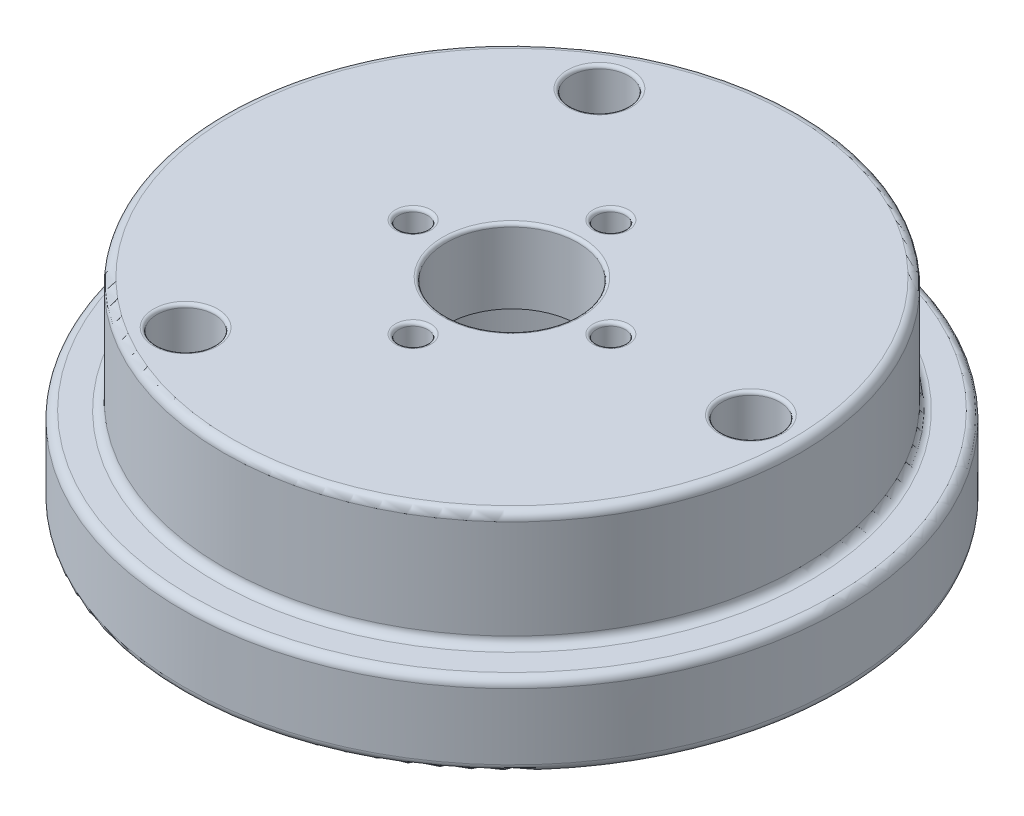
ISO-10303-21;
HEADER;
FILE_DESCRIPTION(('STEP AP214'),'2;1');
FILE_NAME('part.step','',(''),(''),'','','');
FILE_SCHEMA(('AUTOMOTIVE_DESIGN { 1 0 10303 214 1 1 1 1 }'));
ENDSEC;
DATA;
#1=APPLICATION_CONTEXT('core data for automotive mechanical design processes');
#2=APPLICATION_PROTOCOL_DEFINITION('international standard','automotive_design',2000,#1);
#3=PRODUCT_CONTEXT('',#1,'mechanical');
#4=PRODUCT('Part','Part','',(#3));
#5=PRODUCT_RELATED_PRODUCT_CATEGORY('part','',(#4));
#6=PRODUCT_DEFINITION_FORMATION('','',#4);
#7=PRODUCT_DEFINITION_CONTEXT('part definition',#1,'design');
#8=PRODUCT_DEFINITION('design','',#6,#7);
#9=PRODUCT_DEFINITION_SHAPE('','',#8);
#10=(LENGTH_UNIT() NAMED_UNIT(*) SI_UNIT(.MILLI.,.METRE.));
#11=(NAMED_UNIT(*) PLANE_ANGLE_UNIT() SI_UNIT($,.RADIAN.));
#12=(NAMED_UNIT(*) SI_UNIT($,.STERADIAN.) SOLID_ANGLE_UNIT());
#13=UNCERTAINTY_MEASURE_WITH_UNIT(LENGTH_MEASURE(1.E-05),#10,'distance_accuracy_value','');
#14=(GEOMETRIC_REPRESENTATION_CONTEXT(3) GLOBAL_UNCERTAINTY_ASSIGNED_CONTEXT((#13)) GLOBAL_UNIT_ASSIGNED_CONTEXT((#10,
#11,#12)) REPRESENTATION_CONTEXT('',''));
#15=CARTESIAN_POINT('',(0.,0.,0.));
#16=DIRECTION('',(0.,0.,1.));
#17=DIRECTION('',(1.,0.,0.));
#18=AXIS2_PLACEMENT_3D('',#15,#16,#17);
#19=CARTESIAN_POINT('',(0.,12.,0.));
#20=DIRECTION('',(0.,-1.,0.));
#21=DIRECTION('',(0.,0.,-1.));
#22=AXIS2_PLACEMENT_3D('',#19,#20,#21);
#23=CYLINDRICAL_SURFACE('',#22,4.);
#24=CARTESIAN_POINT('',(0.,11.8,0.));
#25=DIRECTION('',(0.,-1.,0.));
#26=DIRECTION('',(0.,0.,-1.));
#27=AXIS2_PLACEMENT_3D('',#24,#25,#26);
#28=CIRCLE('',#27,4.);
#29=CARTESIAN_POINT('',(0.,11.8,-4.));
#30=VERTEX_POINT('',#29);
#31=EDGE_CURVE('E83',#30,#30,#28,.F.);
#32=ORIENTED_EDGE('',*,*,#31,.T.);
#33=EDGE_LOOP('',(#32));
#34=FACE_BOUND('',#33,.T.);
#35=CARTESIAN_POINT('',(0.,7.5,0.));
#36=DIRECTION('',(0.,-1.,0.));
#37=DIRECTION('',(0.,0.,-1.));
#38=AXIS2_PLACEMENT_3D('',#35,#36,#37);
#39=CIRCLE('',#38,4.);
#40=CARTESIAN_POINT('',(0.,7.5,-4.));
#41=VERTEX_POINT('',#40);
#42=EDGE_CURVE('E137',#41,#41,#39,.T.);
#43=ORIENTED_EDGE('',*,*,#42,.T.);
#44=EDGE_LOOP('',(#43));
#45=FACE_BOUND('',#44,.T.);
#46=ADVANCED_FACE('F30',(#34,#45),#23,.F.);
#47=CARTESIAN_POINT('',(-6.,12.,0.));
#48=DIRECTION('',(0.,-1.,0.));
#49=DIRECTION('',(0.,0.,-1.));
#50=AXIS2_PLACEMENT_3D('',#47,#48,#49);
#51=CYLINDRICAL_SURFACE('',#50,0.875);
#52=CARTESIAN_POINT('',(-6.,11.8,0.));
#53=DIRECTION('',(0.,-1.,0.));
#54=DIRECTION('',(0.,0.,-1.));
#55=AXIS2_PLACEMENT_3D('',#52,#53,#54);
#56=CIRCLE('',#55,0.875);
#57=CARTESIAN_POINT('',(-6.,11.8,-0.875));
#58=VERTEX_POINT('',#57);
#59=EDGE_CURVE('E74',#58,#58,#56,.F.);
#60=ORIENTED_EDGE('',*,*,#59,.T.);
#61=EDGE_LOOP('',(#60));
#62=FACE_BOUND('',#61,.T.);
#63=CARTESIAN_POINT('',(-6.,7.5,0.));
#64=DIRECTION('',(0.,-1.,0.));
#65=DIRECTION('',(0.,0.,-1.));
#66=AXIS2_PLACEMENT_3D('',#63,#64,#65);
#67=CIRCLE('',#66,0.875);
#68=CARTESIAN_POINT('',(-6.,7.5,-0.875));
#69=VERTEX_POINT('',#68);
#70=EDGE_CURVE('E146',#69,#69,#67,.T.);
#71=ORIENTED_EDGE('',*,*,#70,.T.);
#72=EDGE_LOOP('',(#71));
#73=FACE_BOUND('',#72,.T.);
#74=ADVANCED_FACE('F180',(#62,#73),#51,.F.);
#75=CARTESIAN_POINT('',(0.,12.,-6.));
#76=DIRECTION('',(0.,-1.,0.));
#77=DIRECTION('',(0.,0.,-1.));
#78=AXIS2_PLACEMENT_3D('',#75,#76,#77);
#79=CYLINDRICAL_SURFACE('',#78,0.875);
#80=CARTESIAN_POINT('',(0.,11.8,-6.));
#81=DIRECTION('',(0.,-1.,0.));
#82=DIRECTION('',(0.,0.,-1.));
#83=AXIS2_PLACEMENT_3D('',#80,#81,#82);
#84=CIRCLE('',#83,0.875);
#85=CARTESIAN_POINT('',(0.,11.8,-6.875));
#86=VERTEX_POINT('',#85);
#87=EDGE_CURVE('E71',#86,#86,#84,.F.);
#88=ORIENTED_EDGE('',*,*,#87,.T.);
#89=EDGE_LOOP('',(#88));
#90=FACE_BOUND('',#89,.T.);
#91=CARTESIAN_POINT('',(0.,7.5,-6.));
#92=DIRECTION('',(0.,-1.,0.));
#93=DIRECTION('',(0.,0.,-1.));
#94=AXIS2_PLACEMENT_3D('',#91,#92,#93);
#95=CIRCLE('',#94,0.875);
#96=CARTESIAN_POINT('',(0.,7.5,-6.875));
#97=VERTEX_POINT('',#96);
#98=EDGE_CURVE('E143',#97,#97,#95,.T.);
#99=ORIENTED_EDGE('',*,*,#98,.T.);
#100=EDGE_LOOP('',(#99));
#101=FACE_BOUND('',#100,.T.);
#102=ADVANCED_FACE('F186',(#90,#101),#79,.F.);
#103=CARTESIAN_POINT('',(6.,12.,0.));
#104=DIRECTION('',(0.,-1.,0.));
#105=DIRECTION('',(0.,0.,-1.));
#106=AXIS2_PLACEMENT_3D('',#103,#104,#105);
#107=CYLINDRICAL_SURFACE('',#106,0.875);
#108=CARTESIAN_POINT('',(6.,11.8,0.));
#109=DIRECTION('',(0.,-1.,0.));
#110=DIRECTION('',(0.,0.,-1.));
#111=AXIS2_PLACEMENT_3D('',#108,#109,#110);
#112=CIRCLE('',#111,0.875);
#113=CARTESIAN_POINT('',(6.,11.8,-0.875));
#114=VERTEX_POINT('',#113);
#115=EDGE_CURVE('E68',#114,#114,#112,.F.);
#116=ORIENTED_EDGE('',*,*,#115,.T.);
#117=EDGE_LOOP('',(#116));
#118=FACE_BOUND('',#117,.T.);
#119=CARTESIAN_POINT('',(6.,7.5,0.));
#120=DIRECTION('',(0.,-1.,0.));
#121=DIRECTION('',(0.,0.,-1.));
#122=AXIS2_PLACEMENT_3D('',#119,#120,#121);
#123=CIRCLE('',#122,0.875);
#124=CARTESIAN_POINT('',(6.,7.5,-0.875));
#125=VERTEX_POINT('',#124);
#126=EDGE_CURVE('E140',#125,#125,#123,.T.);
#127=ORIENTED_EDGE('',*,*,#126,.T.);
#128=EDGE_LOOP('',(#127));
#129=FACE_BOUND('',#128,.T.);
#130=ADVANCED_FACE('F404',(#118,#129),#107,.F.);
#131=CARTESIAN_POINT('',(0.,12.,6.));
#132=DIRECTION('',(0.,-1.,0.));
#133=DIRECTION('',(0.,0.,-1.));
#134=AXIS2_PLACEMENT_3D('',#131,#132,#133);
#135=CYLINDRICAL_SURFACE('',#134,0.875);
#136=CARTESIAN_POINT('',(0.,11.8,6.));
#137=DIRECTION('',(0.,-1.,0.));
#138=DIRECTION('',(0.,0.,-1.));
#139=AXIS2_PLACEMENT_3D('',#136,#137,#138);
#140=CIRCLE('',#139,0.875);
#141=CARTESIAN_POINT('',(0.,11.8,5.125));
#142=VERTEX_POINT('',#141);
#143=EDGE_CURVE('E65',#142,#142,#140,.F.);
#144=ORIENTED_EDGE('',*,*,#143,.T.);
#145=EDGE_LOOP('',(#144));
#146=FACE_BOUND('',#145,.T.);
#147=CARTESIAN_POINT('',(0.,7.5,6.));
#148=DIRECTION('',(0.,-1.,0.));
#149=DIRECTION('',(0.,0.,-1.));
#150=AXIS2_PLACEMENT_3D('',#147,#148,#149);
#151=CIRCLE('',#150,0.875);
#152=CARTESIAN_POINT('',(0.,7.5,5.125));
#153=VERTEX_POINT('',#152);
#154=EDGE_CURVE('E149',#153,#153,#151,.T.);
#155=ORIENTED_EDGE('',*,*,#154,.T.);
#156=EDGE_LOOP('',(#155));
#157=FACE_BOUND('',#156,.T.);
#158=ADVANCED_FACE('F153',(#146,#157),#135,.F.);
#159=CARTESIAN_POINT('',(0.,0.,0.));
#160=DIRECTION('',(0.,1.,0.));
#161=DIRECTION('',(0.,0.,1.));
#162=AXIS2_PLACEMENT_3D('',#159,#160,#161);
#163=PLANE('',#162);
#164=CARTESIAN_POINT('',(14.5,0.,0.));
#165=DIRECTION('',(0.,1.,0.));
#166=DIRECTION('',(0.,0.,1.));
#167=AXIS2_PLACEMENT_3D('',#164,#165,#166);
#168=CIRCLE('',#167,1.85);
#169=CARTESIAN_POINT('',(14.5,0.,1.85));
#170=VERTEX_POINT('',#169);
#171=EDGE_CURVE('E45',#170,#170,#168,.T.);
#172=ORIENTED_EDGE('',*,*,#171,.T.);
#173=EDGE_LOOP('',(#172));
#174=FACE_BOUND('',#173,.T.);
#175=CARTESIAN_POINT('',(-7.24999999999988,0.,12.5573683548744));
#176=DIRECTION('',(0.,1.,0.));
#177=DIRECTION('',(0.,0.,1.));
#178=AXIS2_PLACEMENT_3D('',#175,#176,#177);
#179=CIRCLE('',#178,1.85);
#180=CARTESIAN_POINT('',(-7.24999999999988,0.,14.4073683548744));
#181=VERTEX_POINT('',#180);
#182=EDGE_CURVE('E50',#181,#181,#179,.T.);
#183=ORIENTED_EDGE('',*,*,#182,.T.);
#184=EDGE_LOOP('',(#183));
#185=FACE_BOUND('',#184,.T.);
#186=CARTESIAN_POINT('',(-7.25000000000006,0.,-12.5573683548743));
#187=DIRECTION('',(0.,1.,0.));
#188=DIRECTION('',(0.,0.,1.));
#189=AXIS2_PLACEMENT_3D('',#186,#187,#188);
#190=CIRCLE('',#189,1.85);
#191=CARTESIAN_POINT('',(-7.25000000000006,0.,-10.7073683548743));
#192=VERTEX_POINT('',#191);
#193=EDGE_CURVE('E53',#192,#192,#190,.T.);
#194=ORIENTED_EDGE('',*,*,#193,.T.);
#195=EDGE_LOOP('',(#194));
#196=FACE_BOUND('',#195,.T.);
#197=CARTESIAN_POINT('',(0.,0.,0.));
#198=DIRECTION('',(0.,1.,0.));
#199=DIRECTION('',(0.,0.,1.));
#200=AXIS2_PLACEMENT_3D('',#197,#198,#199);
#201=CIRCLE('',#200,10.1);
#202=CARTESIAN_POINT('',(0.,0.,10.1));
#203=VERTEX_POINT('',#202);
#204=EDGE_CURVE('E56',#203,#203,#201,.T.);
#205=ORIENTED_EDGE('',*,*,#204,.T.);
#206=EDGE_LOOP('',(#205));
#207=FACE_BOUND('',#206,.T.);
#208=CARTESIAN_POINT('',(0.,0.,0.));
#209=DIRECTION('',(0.,1.,0.));
#210=DIRECTION('',(0.,0.,1.));
#211=AXIS2_PLACEMENT_3D('',#208,#209,#210);
#212=CIRCLE('',#211,19.5);
#213=CARTESIAN_POINT('',(0.,0.,19.5));
#214=VERTEX_POINT('',#213);
#215=EDGE_CURVE('E131',#214,#214,#212,.F.);
#216=ORIENTED_EDGE('',*,*,#215,.T.);
#217=EDGE_LOOP('',(#216));
#218=FACE_BOUND('',#217,.T.);
#219=ADVANCED_FACE('F215',(#174,#185,#196,#207,#218),#163,.F.);
#220=CARTESIAN_POINT('',(0.,0.,0.));
#221=DIRECTION('',(0.,-1.,0.));
#222=DIRECTION('',(0.,0.,-1.));
#223=AXIS2_PLACEMENT_3D('',#220,#221,#222);
#224=CYLINDRICAL_SURFACE('',#223,20.);
#225=CARTESIAN_POINT('',(0.,0.5,0.));
#226=DIRECTION('',(0.,1.,0.));
#227=DIRECTION('',(0.,0.,1.));
#228=AXIS2_PLACEMENT_3D('',#225,#226,#227);
#229=CIRCLE('',#228,20.);
#230=CARTESIAN_POINT('',(0.,0.5,20.));
#231=VERTEX_POINT('',#230);
#232=EDGE_CURVE('E125',#231,#231,#229,.T.);
#233=ORIENTED_EDGE('',*,*,#232,.T.);
#234=EDGE_LOOP('',(#233));
#235=FACE_BOUND('',#234,.T.);
#236=CARTESIAN_POINT('',(0.,4.5,0.));
#237=DIRECTION('',(0.,-1.,0.));
#238=DIRECTION('',(0.,0.,-1.));
#239=AXIS2_PLACEMENT_3D('',#236,#237,#238);
#240=CIRCLE('',#239,20.);
#241=CARTESIAN_POINT('',(0.,4.5,-20.));
#242=VERTEX_POINT('',#241);
#243=EDGE_CURVE('E128',#242,#242,#240,.T.);
#244=ORIENTED_EDGE('',*,*,#243,.T.);
#245=EDGE_LOOP('',(#244));
#246=FACE_BOUND('',#245,.T.);
#247=ADVANCED_FACE('F211',(#235,#246),#224,.T.);
#248=CARTESIAN_POINT('',(-20.,5.,0.));
#249=DIRECTION('',(0.,-1.,0.));
#250=DIRECTION('',(0.,0.,-1.));
#251=AXIS2_PLACEMENT_3D('',#248,#249,#250);
#252=PLANE('',#251);
#253=CARTESIAN_POINT('',(0.,5.,0.));
#254=DIRECTION('',(0.,-1.,0.));
#255=DIRECTION('',(0.,0.,-1.));
#256=AXIS2_PLACEMENT_3D('',#253,#254,#255);
#257=CIRCLE('',#256,19.5);
#258=CARTESIAN_POINT('',(0.,5.,-19.5));
#259=VERTEX_POINT('',#258);
#260=EDGE_CURVE('E119',#259,#259,#257,.F.);
#261=ORIENTED_EDGE('',*,*,#260,.T.);
#262=EDGE_LOOP('',(#261));
#263=FACE_BOUND('',#262,.T.);
#264=CARTESIAN_POINT('',(0.,5.,0.));
#265=DIRECTION('',(0.,-1.,0.));
#266=DIRECTION('',(0.,0.,-1.));
#267=AXIS2_PLACEMENT_3D('',#264,#265,#266);
#268=CIRCLE('',#267,18.);
#269=CARTESIAN_POINT('',(0.,5.,-18.));
#270=VERTEX_POINT('',#269);
#271=EDGE_CURVE('E122',#270,#270,#268,.T.);
#272=ORIENTED_EDGE('',*,*,#271,.T.);
#273=EDGE_LOOP('',(#272));
#274=FACE_BOUND('',#273,.T.);
#275=ADVANCED_FACE('F207',(#263,#274),#252,.F.);
#276=CARTESIAN_POINT('',(0.,0.,0.));
#277=DIRECTION('',(0.,-1.,0.));
#278=DIRECTION('',(0.,0.,-1.));
#279=AXIS2_PLACEMENT_3D('',#276,#277,#278);
#280=CYLINDRICAL_SURFACE('',#279,17.5);
#281=CARTESIAN_POINT('',(0.,5.5,0.));
#282=DIRECTION('',(0.,-1.,0.));
#283=DIRECTION('',(0.,0.,-1.));
#284=AXIS2_PLACEMENT_3D('',#281,#282,#283);
#285=CIRCLE('',#284,17.5);
#286=CARTESIAN_POINT('',(0.,5.5,-17.5));
#287=VERTEX_POINT('',#286);
#288=EDGE_CURVE('E113',#287,#287,#285,.F.);
#289=ORIENTED_EDGE('',*,*,#288,.T.);
#290=EDGE_LOOP('',(#289));
#291=FACE_BOUND('',#290,.T.);
#292=CARTESIAN_POINT('',(0.,11.5,0.));
#293=DIRECTION('',(0.,-1.,0.));
#294=DIRECTION('',(0.,0.,-1.));
#295=AXIS2_PLACEMENT_3D('',#292,#293,#294);
#296=CIRCLE('',#295,17.5);
#297=CARTESIAN_POINT('',(0.,11.5,-17.5));
#298=VERTEX_POINT('',#297);
#299=EDGE_CURVE('E116',#298,#298,#296,.T.);
#300=ORIENTED_EDGE('',*,*,#299,.T.);
#301=EDGE_LOOP('',(#300));
#302=FACE_BOUND('',#301,.T.);
#303=ADVANCED_FACE('F203',(#291,#302),#280,.T.);
#304=CARTESIAN_POINT('',(-17.5,12.,0.));
#305=DIRECTION('',(0.,-1.,0.));
#306=DIRECTION('',(0.,0.,-1.));
#307=AXIS2_PLACEMENT_3D('',#304,#305,#306);
#308=PLANE('',#307);
#309=CARTESIAN_POINT('',(0.,12.,0.));
#310=DIRECTION('',(0.,-1.,0.));
#311=DIRECTION('',(0.,0.,-1.));
#312=AXIS2_PLACEMENT_3D('',#309,#310,#311);
#313=CIRCLE('',#312,4.2);
#314=CARTESIAN_POINT('',(0.,12.,-4.2));
#315=VERTEX_POINT('',#314);
#316=EDGE_CURVE('E86',#315,#315,#313,.T.);
#317=ORIENTED_EDGE('',*,*,#316,.T.);
#318=EDGE_LOOP('',(#317));
#319=FACE_BOUND('',#318,.T.);
#320=CARTESIAN_POINT('',(14.5,12.,0.));
#321=DIRECTION('',(0.,-1.,0.));
#322=DIRECTION('',(0.,0.,-1.));
#323=AXIS2_PLACEMENT_3D('',#320,#321,#322);
#324=CIRCLE('',#323,1.95);
#325=CARTESIAN_POINT('',(14.5,12.,-1.95));
#326=VERTEX_POINT('',#325);
#327=EDGE_CURVE('E89',#326,#326,#324,.T.);
#328=ORIENTED_EDGE('',*,*,#327,.T.);
#329=EDGE_LOOP('',(#328));
#330=FACE_BOUND('',#329,.T.);
#331=CARTESIAN_POINT('',(-7.24999999999988,12.,12.5573683548744));
#332=DIRECTION('',(0.,-1.,0.));
#333=DIRECTION('',(0.,0.,-1.));
#334=AXIS2_PLACEMENT_3D('',#331,#332,#333);
#335=CIRCLE('',#334,1.95);
#336=CARTESIAN_POINT('',(-7.24999999999988,12.,10.6073683548744));
#337=VERTEX_POINT('',#336);
#338=EDGE_CURVE('E92',#337,#337,#335,.T.);
#339=ORIENTED_EDGE('',*,*,#338,.T.);
#340=EDGE_LOOP('',(#339));
#341=FACE_BOUND('',#340,.T.);
#342=CARTESIAN_POINT('',(-6.,12.,0.));
#343=DIRECTION('',(0.,-1.,0.));
#344=DIRECTION('',(0.,0.,-1.));
#345=AXIS2_PLACEMENT_3D('',#342,#343,#344);
#346=CIRCLE('',#345,1.075);
#347=CARTESIAN_POINT('',(-6.,12.,-1.075));
#348=VERTEX_POINT('',#347);
#349=EDGE_CURVE('E95',#348,#348,#346,.T.);
#350=ORIENTED_EDGE('',*,*,#349,.T.);
#351=EDGE_LOOP('',(#350));
#352=FACE_BOUND('',#351,.T.);
#353=CARTESIAN_POINT('',(0.,12.,-6.));
#354=DIRECTION('',(0.,-1.,0.));
#355=DIRECTION('',(0.,0.,-1.));
#356=AXIS2_PLACEMENT_3D('',#353,#354,#355);
#357=CIRCLE('',#356,1.075);
#358=CARTESIAN_POINT('',(0.,12.,-7.075));
#359=VERTEX_POINT('',#358);
#360=EDGE_CURVE('E98',#359,#359,#357,.T.);
#361=ORIENTED_EDGE('',*,*,#360,.T.);
#362=EDGE_LOOP('',(#361));
#363=FACE_BOUND('',#362,.T.);
#364=CARTESIAN_POINT('',(6.,12.,0.));
#365=DIRECTION('',(0.,-1.,0.));
#366=DIRECTION('',(0.,0.,-1.));
#367=AXIS2_PLACEMENT_3D('',#364,#365,#366);
#368=CIRCLE('',#367,1.075);
#369=CARTESIAN_POINT('',(6.,12.,-1.075));
#370=VERTEX_POINT('',#369);
#371=EDGE_CURVE('E101',#370,#370,#368,.T.);
#372=ORIENTED_EDGE('',*,*,#371,.T.);
#373=EDGE_LOOP('',(#372));
#374=FACE_BOUND('',#373,.T.);
#375=CARTESIAN_POINT('',(0.,12.,6.));
#376=DIRECTION('',(0.,-1.,0.));
#377=DIRECTION('',(0.,0.,-1.));
#378=AXIS2_PLACEMENT_3D('',#375,#376,#377);
#379=CIRCLE('',#378,1.075);
#380=CARTESIAN_POINT('',(0.,12.,4.925));
#381=VERTEX_POINT('',#380);
#382=EDGE_CURVE('E104',#381,#381,#379,.T.);
#383=ORIENTED_EDGE('',*,*,#382,.T.);
#384=EDGE_LOOP('',(#383));
#385=FACE_BOUND('',#384,.T.);
#386=CARTESIAN_POINT('',(-7.25000000000006,12.,-12.5573683548743));
#387=DIRECTION('',(0.,-1.,0.));
#388=DIRECTION('',(0.,0.,-1.));
#389=AXIS2_PLACEMENT_3D('',#386,#387,#388);
#390=CIRCLE('',#389,1.95);
#391=CARTESIAN_POINT('',(-7.25000000000006,12.,-14.5073683548743));
#392=VERTEX_POINT('',#391);
#393=EDGE_CURVE('E107',#392,#392,#390,.T.);
#394=ORIENTED_EDGE('',*,*,#393,.T.);
#395=EDGE_LOOP('',(#394));
#396=FACE_BOUND('',#395,.T.);
#397=CARTESIAN_POINT('',(0.,12.,0.));
#398=DIRECTION('',(0.,-1.,0.));
#399=DIRECTION('',(0.,0.,-1.));
#400=AXIS2_PLACEMENT_3D('',#397,#398,#399);
#401=CIRCLE('',#400,17.);
#402=CARTESIAN_POINT('',(0.,12.,-17.));
#403=VERTEX_POINT('',#402);
#404=EDGE_CURVE('E110',#403,#403,#401,.F.);
#405=ORIENTED_EDGE('',*,*,#404,.T.);
#406=EDGE_LOOP('',(#405));
#407=FACE_BOUND('',#406,.T.);
#408=ADVANCED_FACE('F196',(#319,#330,#341,#352,#363,#374,#385,#396,#407),#308,.F.);
#409=CARTESIAN_POINT('',(14.5,12.,0.));
#410=DIRECTION('',(0.,-1.,0.));
#411=DIRECTION('',(0.,0.,-1.));
#412=AXIS2_PLACEMENT_3D('',#409,#410,#411);
#413=CYLINDRICAL_SURFACE('',#412,1.75);
#414=CARTESIAN_POINT('',(14.5,0.0999999999999994,0.));
#415=DIRECTION('',(0.,1.,0.));
#416=DIRECTION('',(0.,0.,1.));
#417=AXIS2_PLACEMENT_3D('',#414,#415,#416);
#418=CIRCLE('',#417,1.75);
#419=CARTESIAN_POINT('',(14.5,0.0999999999999994,1.75));
#420=VERTEX_POINT('',#419);
#421=EDGE_CURVE('E59',#420,#420,#418,.F.);
#422=ORIENTED_EDGE('',*,*,#421,.T.);
#423=EDGE_LOOP('',(#422));
#424=FACE_BOUND('',#423,.T.);
#425=CARTESIAN_POINT('',(14.5,11.8,0.));
#426=DIRECTION('',(0.,-1.,0.));
#427=DIRECTION('',(0.,0.,-1.));
#428=AXIS2_PLACEMENT_3D('',#425,#426,#427);
#429=CIRCLE('',#428,1.75);
#430=CARTESIAN_POINT('',(14.5,11.8,-1.75));
#431=VERTEX_POINT('',#430);
#432=EDGE_CURVE('E80',#431,#431,#429,.F.);
#433=ORIENTED_EDGE('',*,*,#432,.T.);
#434=EDGE_LOOP('',(#433));
#435=FACE_BOUND('',#434,.T.);
#436=ADVANCED_FACE('F193',(#424,#435),#413,.F.);
#437=CARTESIAN_POINT('',(-7.24999999999988,12.,12.5573683548744));
#438=DIRECTION('',(0.,-1.,0.));
#439=DIRECTION('',(0.,0.,-1.));
#440=AXIS2_PLACEMENT_3D('',#437,#438,#439);
#441=CYLINDRICAL_SURFACE('',#440,1.75);
#442=CARTESIAN_POINT('',(-7.24999999999988,0.0999999999999994,12.5573683548744));
#443=DIRECTION('',(0.,1.,0.));
#444=DIRECTION('',(0.,0.,1.));
#445=AXIS2_PLACEMENT_3D('',#442,#443,#444);
#446=CIRCLE('',#445,1.75);
#447=CARTESIAN_POINT('',(-7.24999999999988,0.0999999999999994,14.3073683548744));
#448=VERTEX_POINT('',#447);
#449=EDGE_CURVE('E41',#448,#448,#446,.F.);
#450=ORIENTED_EDGE('',*,*,#449,.T.);
#451=EDGE_LOOP('',(#450));
#452=FACE_BOUND('',#451,.T.);
#453=CARTESIAN_POINT('',(-7.24999999999988,11.8,12.5573683548744));
#454=DIRECTION('',(0.,-1.,0.));
#455=DIRECTION('',(0.,0.,-1.));
#456=AXIS2_PLACEMENT_3D('',#453,#454,#455);
#457=CIRCLE('',#456,1.75);
#458=CARTESIAN_POINT('',(-7.24999999999988,11.8,10.8073683548744));
#459=VERTEX_POINT('',#458);
#460=EDGE_CURVE('E77',#459,#459,#457,.F.);
#461=ORIENTED_EDGE('',*,*,#460,.T.);
#462=EDGE_LOOP('',(#461));
#463=FACE_BOUND('',#462,.T.);
#464=ADVANCED_FACE('F177',(#452,#463),#441,.F.);
#465=CARTESIAN_POINT('',(-7.25000000000006,12.,-12.5573683548743));
#466=DIRECTION('',(0.,-1.,0.));
#467=DIRECTION('',(0.,0.,-1.));
#468=AXIS2_PLACEMENT_3D('',#465,#466,#467);
#469=CYLINDRICAL_SURFACE('',#468,1.75);
#470=CARTESIAN_POINT('',(-7.25000000000006,0.0999999999999994,-12.5573683548743));
#471=DIRECTION('',(0.,1.,0.));
#472=DIRECTION('',(0.,0.,1.));
#473=AXIS2_PLACEMENT_3D('',#470,#471,#472);
#474=CIRCLE('',#473,1.75);
#475=CARTESIAN_POINT('',(-7.25000000000006,0.0999999999999994,-10.8073683548743));
#476=VERTEX_POINT('',#475);
#477=EDGE_CURVE('E37',#476,#476,#474,.F.);
#478=ORIENTED_EDGE('',*,*,#477,.T.);
#479=EDGE_LOOP('',(#478));
#480=FACE_BOUND('',#479,.T.);
#481=CARTESIAN_POINT('',(-7.25000000000006,11.8,-12.5573683548743));
#482=DIRECTION('',(0.,-1.,0.));
#483=DIRECTION('',(0.,0.,-1.));
#484=AXIS2_PLACEMENT_3D('',#481,#482,#483);
#485=CIRCLE('',#484,1.75);
#486=CARTESIAN_POINT('',(-7.25000000000006,11.8,-14.3073683548743));
#487=VERTEX_POINT('',#486);
#488=EDGE_CURVE('E62',#487,#487,#485,.F.);
#489=ORIENTED_EDGE('',*,*,#488,.T.);
#490=EDGE_LOOP('',(#489));
#491=FACE_BOUND('',#490,.T.);
#492=ADVANCED_FACE('F172',(#480,#491),#469,.F.);
#493=CARTESIAN_POINT('',(0.,7.5,0.));
#494=DIRECTION('',(0.,-1.,0.));
#495=DIRECTION('',(0.,0.,-1.));
#496=AXIS2_PLACEMENT_3D('',#493,#494,#495);
#497=CYLINDRICAL_SURFACE('',#496,10.);
#498=CARTESIAN_POINT('',(0.,0.1,0.));
#499=DIRECTION('',(0.,1.,0.));
#500=DIRECTION('',(0.,0.,1.));
#501=AXIS2_PLACEMENT_3D('',#498,#499,#500);
#502=CIRCLE('',#501,10.);
#503=CARTESIAN_POINT('',(0.,0.1,10.));
#504=VERTEX_POINT('',#503);
#505=EDGE_CURVE('E10',#504,#504,#502,.F.);
#506=ORIENTED_EDGE('',*,*,#505,.T.);
#507=EDGE_LOOP('',(#506));
#508=FACE_BOUND('',#507,.T.);
#509=CARTESIAN_POINT('',(0.,7.5,0.));
#510=DIRECTION('',(0.,-1.,0.));
#511=DIRECTION('',(0.,0.,-1.));
#512=AXIS2_PLACEMENT_3D('',#509,#510,#511);
#513=CIRCLE('',#512,10.);
#514=CARTESIAN_POINT('',(0.,7.5,-10.));
#515=VERTEX_POINT('',#514);
#516=EDGE_CURVE('E134',#515,#515,#513,.T.);
#517=ORIENTED_EDGE('',*,*,#516,.F.);
#518=EDGE_LOOP('',(#517));
#519=FACE_BOUND('',#518,.T.);
#520=ADVANCED_FACE('F159',(#508,#519),#497,.F.);
#521=CARTESIAN_POINT('',(0.,7.5,0.));
#522=DIRECTION('',(0.,-1.,0.));
#523=DIRECTION('',(0.,0.,-1.));
#524=AXIS2_PLACEMENT_3D('',#521,#522,#523);
#525=PLANE('',#524);
#526=ORIENTED_EDGE('',*,*,#154,.F.);
#527=EDGE_LOOP('',(#526));
#528=FACE_BOUND('',#527,.T.);
#529=ORIENTED_EDGE('',*,*,#70,.F.);
#530=EDGE_LOOP('',(#529));
#531=FACE_BOUND('',#530,.T.);
#532=ORIENTED_EDGE('',*,*,#98,.F.);
#533=EDGE_LOOP('',(#532));
#534=FACE_BOUND('',#533,.T.);
#535=ORIENTED_EDGE('',*,*,#126,.F.);
#536=EDGE_LOOP('',(#535));
#537=FACE_BOUND('',#536,.T.);
#538=ORIENTED_EDGE('',*,*,#42,.F.);
#539=EDGE_LOOP('',(#538));
#540=FACE_BOUND('',#539,.T.);
#541=ORIENTED_EDGE('',*,*,#516,.T.);
#542=EDGE_LOOP('',(#541));
#543=FACE_BOUND('',#542,.T.);
#544=ADVANCED_FACE('F155',(#528,#531,#534,#537,#540,#543),#525,.T.);
#545=CARTESIAN_POINT('',(0.,0.5,0.));
#546=DIRECTION('',(0.,1.,0.));
#547=DIRECTION('',(0.,0.,1.));
#548=AXIS2_PLACEMENT_3D('',#545,#546,#547);
#549=TOROIDAL_SURFACE('',#548,19.5,0.5);
#550=ORIENTED_EDGE('',*,*,#232,.F.);
#551=EDGE_LOOP('',(#550));
#552=FACE_BOUND('',#551,.T.);
#553=ORIENTED_EDGE('',*,*,#215,.F.);
#554=EDGE_LOOP('',(#553));
#555=FACE_BOUND('',#554,.T.);
#556=ADVANCED_FACE('F158',(#552,#555),#549,.T.);
#557=CARTESIAN_POINT('',(0.,4.5,0.));
#558=DIRECTION('',(0.,-1.,0.));
#559=DIRECTION('',(0.,0.,-1.));
#560=AXIS2_PLACEMENT_3D('',#557,#558,#559);
#561=TOROIDAL_SURFACE('',#560,19.5,0.5);
#562=ORIENTED_EDGE('',*,*,#260,.F.);
#563=EDGE_LOOP('',(#562));
#564=FACE_BOUND('',#563,.T.);
#565=ORIENTED_EDGE('',*,*,#243,.F.);
#566=EDGE_LOOP('',(#565));
#567=FACE_BOUND('',#566,.T.);
#568=ADVANCED_FACE('F222',(#564,#567),#561,.T.);
#569=CARTESIAN_POINT('',(0.,5.5,0.));
#570=DIRECTION('',(0.,-1.,0.));
#571=DIRECTION('',(0.,0.,-1.));
#572=AXIS2_PLACEMENT_3D('',#569,#570,#571);
#573=TOROIDAL_SURFACE('',#572,18.,0.5);
#574=ORIENTED_EDGE('',*,*,#288,.F.);
#575=EDGE_LOOP('',(#574));
#576=FACE_BOUND('',#575,.T.);
#577=ORIENTED_EDGE('',*,*,#271,.F.);
#578=EDGE_LOOP('',(#577));
#579=FACE_BOUND('',#578,.T.);
#580=ADVANCED_FACE('F226',(#576,#579),#573,.F.);
#581=CARTESIAN_POINT('',(0.,11.5,0.));
#582=DIRECTION('',(0.,-1.,0.));
#583=DIRECTION('',(0.,0.,-1.));
#584=AXIS2_PLACEMENT_3D('',#581,#582,#583);
#585=TOROIDAL_SURFACE('',#584,17.,0.5);
#586=ORIENTED_EDGE('',*,*,#404,.F.);
#587=EDGE_LOOP('',(#586));
#588=FACE_BOUND('',#587,.T.);
#589=ORIENTED_EDGE('',*,*,#299,.F.);
#590=EDGE_LOOP('',(#589));
#591=FACE_BOUND('',#590,.T.);
#592=ADVANCED_FACE('F230',(#588,#591),#585,.T.);
#593=CARTESIAN_POINT('',(0.,11.8,0.));
#594=DIRECTION('',(0.,-1.,0.));
#595=DIRECTION('',(0.,0.,-1.));
#596=AXIS2_PLACEMENT_3D('',#593,#594,#595);
#597=TOROIDAL_SURFACE('',#596,4.2,0.2);
#598=ORIENTED_EDGE('',*,*,#31,.F.);
#599=EDGE_LOOP('',(#598));
#600=FACE_BOUND('',#599,.T.);
#601=ORIENTED_EDGE('',*,*,#316,.F.);
#602=EDGE_LOOP('',(#601));
#603=FACE_BOUND('',#602,.T.);
#604=ADVANCED_FACE('F234',(#600,#603),#597,.T.);
#605=CARTESIAN_POINT('',(14.5,11.8,0.));
#606=DIRECTION('',(0.,-1.,0.));
#607=DIRECTION('',(0.,0.,-1.));
#608=AXIS2_PLACEMENT_3D('',#605,#606,#607);
#609=TOROIDAL_SURFACE('',#608,1.95,0.2);
#610=ORIENTED_EDGE('',*,*,#432,.F.);
#611=EDGE_LOOP('',(#610));
#612=FACE_BOUND('',#611,.T.);
#613=ORIENTED_EDGE('',*,*,#327,.F.);
#614=EDGE_LOOP('',(#613));
#615=FACE_BOUND('',#614,.T.);
#616=ADVANCED_FACE('F238',(#612,#615),#609,.T.);
#617=CARTESIAN_POINT('',(-7.24999999999988,11.8,12.5573683548744));
#618=DIRECTION('',(0.,-1.,0.));
#619=DIRECTION('',(0.,0.,-1.));
#620=AXIS2_PLACEMENT_3D('',#617,#618,#619);
#621=TOROIDAL_SURFACE('',#620,1.95,0.2);
#622=ORIENTED_EDGE('',*,*,#460,.F.);
#623=EDGE_LOOP('',(#622));
#624=FACE_BOUND('',#623,.T.);
#625=ORIENTED_EDGE('',*,*,#338,.F.);
#626=EDGE_LOOP('',(#625));
#627=FACE_BOUND('',#626,.T.);
#628=ADVANCED_FACE('F242',(#624,#627),#621,.T.);
#629=CARTESIAN_POINT('',(-6.,11.8,0.));
#630=DIRECTION('',(0.,-1.,0.));
#631=DIRECTION('',(0.,0.,-1.));
#632=AXIS2_PLACEMENT_3D('',#629,#630,#631);
#633=TOROIDAL_SURFACE('',#632,1.075,0.2);
#634=ORIENTED_EDGE('',*,*,#59,.F.);
#635=EDGE_LOOP('',(#634));
#636=FACE_BOUND('',#635,.T.);
#637=ORIENTED_EDGE('',*,*,#349,.F.);
#638=EDGE_LOOP('',(#637));
#639=FACE_BOUND('',#638,.T.);
#640=ADVANCED_FACE('F246',(#636,#639),#633,.T.);
#641=CARTESIAN_POINT('',(0.,11.8,-6.));
#642=DIRECTION('',(0.,-1.,0.));
#643=DIRECTION('',(0.,0.,-1.));
#644=AXIS2_PLACEMENT_3D('',#641,#642,#643);
#645=TOROIDAL_SURFACE('',#644,1.075,0.2);
#646=ORIENTED_EDGE('',*,*,#87,.F.);
#647=EDGE_LOOP('',(#646));
#648=FACE_BOUND('',#647,.T.);
#649=ORIENTED_EDGE('',*,*,#360,.F.);
#650=EDGE_LOOP('',(#649));
#651=FACE_BOUND('',#650,.T.);
#652=ADVANCED_FACE('F250',(#648,#651),#645,.T.);
#653=CARTESIAN_POINT('',(6.,11.8,0.));
#654=DIRECTION('',(0.,-1.,0.));
#655=DIRECTION('',(0.,0.,-1.));
#656=AXIS2_PLACEMENT_3D('',#653,#654,#655);
#657=TOROIDAL_SURFACE('',#656,1.075,0.2);
#658=ORIENTED_EDGE('',*,*,#115,.F.);
#659=EDGE_LOOP('',(#658));
#660=FACE_BOUND('',#659,.T.);
#661=ORIENTED_EDGE('',*,*,#371,.F.);
#662=EDGE_LOOP('',(#661));
#663=FACE_BOUND('',#662,.T.);
#664=ADVANCED_FACE('F254',(#660,#663),#657,.T.);
#665=CARTESIAN_POINT('',(0.,11.8,6.));
#666=DIRECTION('',(0.,-1.,0.));
#667=DIRECTION('',(0.,0.,-1.));
#668=AXIS2_PLACEMENT_3D('',#665,#666,#667);
#669=TOROIDAL_SURFACE('',#668,1.075,0.2);
#670=ORIENTED_EDGE('',*,*,#143,.F.);
#671=EDGE_LOOP('',(#670));
#672=FACE_BOUND('',#671,.T.);
#673=ORIENTED_EDGE('',*,*,#382,.F.);
#674=EDGE_LOOP('',(#673));
#675=FACE_BOUND('',#674,.T.);
#676=ADVANCED_FACE('F258',(#672,#675),#669,.T.);
#677=CARTESIAN_POINT('',(-7.25000000000006,11.8,-12.5573683548743));
#678=DIRECTION('',(0.,-1.,0.));
#679=DIRECTION('',(0.,0.,-1.));
#680=AXIS2_PLACEMENT_3D('',#677,#678,#679);
#681=TOROIDAL_SURFACE('',#680,1.95,0.2);
#682=ORIENTED_EDGE('',*,*,#488,.F.);
#683=EDGE_LOOP('',(#682));
#684=FACE_BOUND('',#683,.T.);
#685=ORIENTED_EDGE('',*,*,#393,.F.);
#686=EDGE_LOOP('',(#685));
#687=FACE_BOUND('',#686,.T.);
#688=ADVANCED_FACE('F262',(#684,#687),#681,.T.);
#689=CARTESIAN_POINT('',(14.5,0.0999999999999994,0.));
#690=DIRECTION('',(0.,1.,0.));
#691=DIRECTION('',(0.,0.,1.));
#692=AXIS2_PLACEMENT_3D('',#689,#690,#691);
#693=TOROIDAL_SURFACE('',#692,1.85,0.1);
#694=ORIENTED_EDGE('',*,*,#171,.F.);
#695=EDGE_LOOP('',(#694));
#696=FACE_BOUND('',#695,.T.);
#697=ORIENTED_EDGE('',*,*,#421,.F.);
#698=EDGE_LOOP('',(#697));
#699=FACE_BOUND('',#698,.T.);
#700=ADVANCED_FACE('F266',(#696,#699),#693,.T.);
#701=CARTESIAN_POINT('',(-7.24999999999988,0.0999999999999994,12.5573683548744));
#702=DIRECTION('',(0.,1.,0.));
#703=DIRECTION('',(0.,0.,1.));
#704=AXIS2_PLACEMENT_3D('',#701,#702,#703);
#705=TOROIDAL_SURFACE('',#704,1.85,0.1);
#706=ORIENTED_EDGE('',*,*,#182,.F.);
#707=EDGE_LOOP('',(#706));
#708=FACE_BOUND('',#707,.T.);
#709=ORIENTED_EDGE('',*,*,#449,.F.);
#710=EDGE_LOOP('',(#709));
#711=FACE_BOUND('',#710,.T.);
#712=ADVANCED_FACE('F270',(#708,#711),#705,.T.);
#713=CARTESIAN_POINT('',(-7.25000000000006,0.0999999999999994,-12.5573683548743));
#714=DIRECTION('',(0.,1.,0.));
#715=DIRECTION('',(0.,0.,1.));
#716=AXIS2_PLACEMENT_3D('',#713,#714,#715);
#717=TOROIDAL_SURFACE('',#716,1.85,0.1);
#718=ORIENTED_EDGE('',*,*,#193,.F.);
#719=EDGE_LOOP('',(#718));
#720=FACE_BOUND('',#719,.T.);
#721=ORIENTED_EDGE('',*,*,#477,.F.);
#722=EDGE_LOOP('',(#721));
#723=FACE_BOUND('',#722,.T.);
#724=ADVANCED_FACE('F273',(#720,#723),#717,.T.);
#725=CARTESIAN_POINT('',(0.,0.1,0.));
#726=DIRECTION('',(0.,1.,0.));
#727=DIRECTION('',(0.,0.,1.));
#728=AXIS2_PLACEMENT_3D('',#725,#726,#727);
#729=TOROIDAL_SURFACE('',#728,10.1,0.1);
#730=ORIENTED_EDGE('',*,*,#204,.F.);
#731=EDGE_LOOP('',(#730));
#732=FACE_BOUND('',#731,.T.);
#733=ORIENTED_EDGE('',*,*,#505,.F.);
#734=EDGE_LOOP('',(#733));
#735=FACE_BOUND('',#734,.T.);
#736=ADVANCED_FACE('F32',(#732,#735),#729,.T.);
#737=CLOSED_SHELL('',(#46,#74,#102,#130,#158,#219,#247,#275,#303,#408,#436,#464,#492,#520,#544,
#556,#568,#580,#592,#604,#616,#628,#640,#652,#664,#676,#688,#700,#712,#724,#736));
#738=MANIFOLD_SOLID_BREP('B2',#737);
#739=ADVANCED_BREP_SHAPE_REPRESENTATION('',(#18,#738),#14);
#740=SHAPE_DEFINITION_REPRESENTATION(#9,#739);
ENDSEC;
END-ISO-10303-21;
